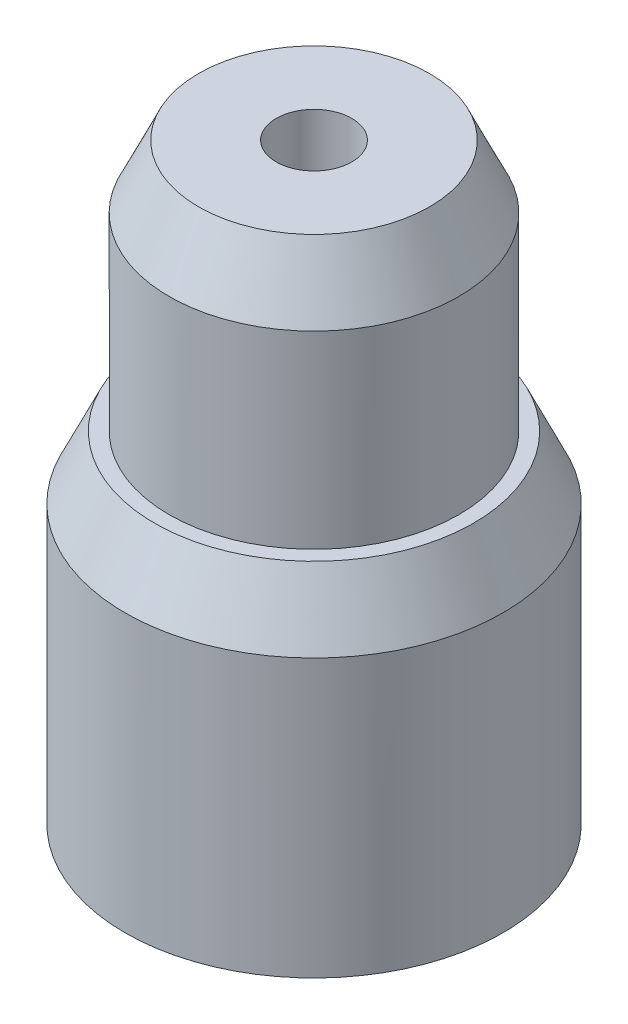
ISO-10303-21;
HEADER;
FILE_DESCRIPTION(('STEP AP214'),'2;1');
FILE_NAME('part.step','',(''),(''),'','','');
FILE_SCHEMA(('AUTOMOTIVE_DESIGN { 1 0 10303 214 1 1 1 1 }'));
ENDSEC;
DATA;
#1=APPLICATION_CONTEXT('core data for automotive mechanical design processes');
#2=APPLICATION_PROTOCOL_DEFINITION('international standard','automotive_design',2000,#1);
#3=PRODUCT_CONTEXT('',#1,'mechanical');
#4=PRODUCT('Part','Part','',(#3));
#5=PRODUCT_RELATED_PRODUCT_CATEGORY('part','',(#4));
#6=PRODUCT_DEFINITION_FORMATION('','',#4);
#7=PRODUCT_DEFINITION_CONTEXT('part definition',#1,'design');
#8=PRODUCT_DEFINITION('design','',#6,#7);
#9=PRODUCT_DEFINITION_SHAPE('','',#8);
#10=(LENGTH_UNIT() NAMED_UNIT(*) SI_UNIT(.MILLI.,.METRE.));
#11=(NAMED_UNIT(*) PLANE_ANGLE_UNIT() SI_UNIT($,.RADIAN.));
#12=(NAMED_UNIT(*) SI_UNIT($,.STERADIAN.) SOLID_ANGLE_UNIT());
#13=UNCERTAINTY_MEASURE_WITH_UNIT(LENGTH_MEASURE(1.E-05),#10,'distance_accuracy_value','');
#14=(GEOMETRIC_REPRESENTATION_CONTEXT(3) GLOBAL_UNCERTAINTY_ASSIGNED_CONTEXT((#13)) GLOBAL_UNIT_ASSIGNED_CONTEXT((#10,
#11,#12)) REPRESENTATION_CONTEXT('',''));
#15=CARTESIAN_POINT('',(0.,0.,0.));
#16=DIRECTION('',(0.,0.,1.));
#17=DIRECTION('',(1.,0.,0.));
#18=AXIS2_PLACEMENT_3D('',#15,#16,#17);
#19=CARTESIAN_POINT('',(0.,27.,0.));
#20=DIRECTION('',(0.,-1.,0.));
#21=DIRECTION('',(0.,0.,-1.));
#22=AXIS2_PLACEMENT_3D('',#19,#20,#21);
#23=CYLINDRICAL_SURFACE('',#22,15.);
#24=CARTESIAN_POINT('',(0.,21.9999999999999,0.));
#25=DIRECTION('',(0.,1.,0.));
#26=DIRECTION('',(0.,0.,1.));
#27=AXIS2_PLACEMENT_3D('',#24,#25,#26);
#28=CIRCLE('',#27,15.);
#29=CARTESIAN_POINT('',(0.,21.9999999999999,-15.));
#30=VERTEX_POINT('',#29);
#31=EDGE_CURVE('E10',#30,#30,#28,.F.);
#32=ORIENTED_EDGE('',*,*,#31,.T.);
#33=EDGE_LOOP('',(#32));
#34=FACE_BOUND('',#33,.T.);
#35=CARTESIAN_POINT('',(0.,0.,0.));
#36=DIRECTION('',(0.,1.,0.));
#37=DIRECTION('',(0.,0.,1.));
#38=AXIS2_PLACEMENT_3D('',#35,#36,#37);
#39=CIRCLE('',#38,15.);
#40=CARTESIAN_POINT('',(0.,0.,15.));
#41=VERTEX_POINT('',#40);
#42=EDGE_CURVE('E54',#41,#41,#39,.T.);
#43=ORIENTED_EDGE('',*,*,#42,.T.);
#44=EDGE_LOOP('',(#43));
#45=FACE_BOUND('',#44,.T.);
#46=ADVANCED_FACE('F34',(#34,#45),#23,.T.);
#47=CARTESIAN_POINT('',(0.,27.,0.));
#48=DIRECTION('',(0.,1.,0.));
#49=DIRECTION('',(0.,0.,1.));
#50=AXIS2_PLACEMENT_3D('',#47,#48,#49);
#51=PLANE('',#50);
#52=CARTESIAN_POINT('',(0.,27.,0.));
#53=DIRECTION('',(0.,1.,0.));
#54=DIRECTION('',(0.,0.,1.));
#55=AXIS2_PLACEMENT_3D('',#52,#53,#54);
#56=CIRCLE('',#55,12.668461709225);
#57=CARTESIAN_POINT('',(0.,27.,-12.668461709225));
#58=VERTEX_POINT('',#57);
#59=EDGE_CURVE('E41',#58,#58,#56,.T.);
#60=ORIENTED_EDGE('',*,*,#59,.T.);
#61=EDGE_LOOP('',(#60));
#62=FACE_BOUND('',#61,.T.);
#63=CARTESIAN_POINT('',(0.,27.,0.));
#64=DIRECTION('',(0.,1.,0.));
#65=DIRECTION('',(0.,0.,1.));
#66=AXIS2_PLACEMENT_3D('',#63,#64,#65);
#67=CIRCLE('',#66,11.5);
#68=CARTESIAN_POINT('',(0.,27.,11.5));
#69=VERTEX_POINT('',#68);
#70=EDGE_CURVE('E57',#69,#69,#67,.T.);
#71=ORIENTED_EDGE('',*,*,#70,.F.);
#72=EDGE_LOOP('',(#71));
#73=FACE_BOUND('',#72,.T.);
#74=ADVANCED_FACE('F100',(#62,#73),#51,.T.);
#75=CARTESIAN_POINT('',(0.,0.,0.));
#76=DIRECTION('',(0.,1.,0.));
#77=DIRECTION('',(0.,0.,1.));
#78=AXIS2_PLACEMENT_3D('',#75,#76,#77);
#79=PLANE('',#78);
#80=CARTESIAN_POINT('',(0.,0.,0.));
#81=DIRECTION('',(0.,-1.,0.));
#82=DIRECTION('',(0.,0.,-1.));
#83=AXIS2_PLACEMENT_3D('',#80,#81,#82);
#84=CIRCLE('',#83,5.);
#85=CARTESIAN_POINT('',(0.,0.,-5.));
#86=VERTEX_POINT('',#85);
#87=EDGE_CURVE('E61',#86,#86,#84,.T.);
#88=ORIENTED_EDGE('',*,*,#87,.F.);
#89=EDGE_LOOP('',(#88));
#90=FACE_BOUND('',#89,.T.);
#91=ORIENTED_EDGE('',*,*,#42,.F.);
#92=EDGE_LOOP('',(#91));
#93=FACE_BOUND('',#92,.T.);
#94=ADVANCED_FACE('F104',(#90,#93),#79,.F.);
#95=CARTESIAN_POINT('',(0.,47.,0.));
#96=DIRECTION('',(0.,-1.,0.));
#97=DIRECTION('',(0.,0.,-1.));
#98=AXIS2_PLACEMENT_3D('',#95,#96,#97);
#99=CYLINDRICAL_SURFACE('',#98,11.5);
#100=CARTESIAN_POINT('',(0.,42.,0.));
#101=DIRECTION('',(0.,1.,0.));
#102=DIRECTION('',(0.,0.,1.));
#103=AXIS2_PLACEMENT_3D('',#100,#101,#102);
#104=CIRCLE('',#103,11.5);
#105=CARTESIAN_POINT('',(0.,42.,-11.5));
#106=VERTEX_POINT('',#105);
#107=EDGE_CURVE('E45',#106,#106,#104,.F.);
#108=ORIENTED_EDGE('',*,*,#107,.T.);
#109=EDGE_LOOP('',(#108));
#110=FACE_BOUND('',#109,.T.);
#111=ORIENTED_EDGE('',*,*,#70,.T.);
#112=EDGE_LOOP('',(#111));
#113=FACE_BOUND('',#112,.T.);
#114=ADVANCED_FACE('F86',(#110,#113),#99,.T.);
#115=CARTESIAN_POINT('',(0.,47.,0.));
#116=DIRECTION('',(0.,1.,0.));
#117=DIRECTION('',(0.,0.,1.));
#118=AXIS2_PLACEMENT_3D('',#115,#116,#117);
#119=PLANE('',#118);
#120=CARTESIAN_POINT('',(0.,47.,0.));
#121=DIRECTION('',(0.,1.,0.));
#122=DIRECTION('',(0.,0.,1.));
#123=AXIS2_PLACEMENT_3D('',#120,#121,#122);
#124=CIRCLE('',#123,3.);
#125=CARTESIAN_POINT('',(0.,47.,3.));
#126=VERTEX_POINT('',#125);
#127=EDGE_CURVE('E67',#126,#126,#124,.T.);
#128=ORIENTED_EDGE('',*,*,#127,.F.);
#129=EDGE_LOOP('',(#128));
#130=FACE_BOUND('',#129,.T.);
#131=CARTESIAN_POINT('',(0.,47.,0.));
#132=DIRECTION('',(0.,1.,0.));
#133=DIRECTION('',(0.,0.,1.));
#134=AXIS2_PLACEMENT_3D('',#131,#132,#133);
#135=CIRCLE('',#134,9.16846170922502);
#136=CARTESIAN_POINT('',(0.,47.,-9.16846170922502));
#137=VERTEX_POINT('',#136);
#138=EDGE_CURVE('E49',#137,#137,#135,.T.);
#139=ORIENTED_EDGE('',*,*,#138,.T.);
#140=EDGE_LOOP('',(#139));
#141=FACE_BOUND('',#140,.T.);
#142=ADVANCED_FACE('F82',(#130,#141),#119,.T.);
#143=CARTESIAN_POINT('',(0.,47.,0.));
#144=DIRECTION('',(0.,-1.,0.));
#145=DIRECTION('',(0.,0.,-1.));
#146=AXIS2_PLACEMENT_3D('',#143,#144,#145);
#147=CONICAL_SURFACE('',#146,9.16846170922502,0.436332312998579);
#148=CARTESIAN_POINT('',(0.,42.,-11.5));
#149=CARTESIAN_POINT('',(0.,42.0520833333333,-11.4757131428044));
#150=CARTESIAN_POINT('',(0.,42.1041666666666,-11.4514262856089));
#151=CARTESIAN_POINT('',(0.,42.2083333333333,-11.4028525712177));
#152=CARTESIAN_POINT('',(0.,42.2604166666666,-11.3785657140221));
#153=CARTESIAN_POINT('',(0.,42.3645833333333,-11.329991999631));
#154=CARTESIAN_POINT('',(0.,42.4166666666666,-11.3057051424354));
#155=CARTESIAN_POINT('',(0.,42.5208333333333,-11.2571314280443));
#156=CARTESIAN_POINT('',(0.,42.5729166666666,-11.2328445708487));
#157=CARTESIAN_POINT('',(0.,42.6770833333333,-11.1842708564576));
#158=CARTESIAN_POINT('',(0.,42.7291666666666,-11.159983999262));
#159=CARTESIAN_POINT('',(0.,42.8333333333333,-11.1114102848708));
#160=CARTESIAN_POINT('',(0.,42.8854166666666,-11.0871234276753));
#161=CARTESIAN_POINT('',(0.,42.9895833333333,-11.0385497132841));
#162=CARTESIAN_POINT('',(0.,43.0416666666666,-11.0142628560885));
#163=CARTESIAN_POINT('',(0.,43.1458333333333,-10.9656891416974));
#164=CARTESIAN_POINT('',(0.,43.1979166666666,-10.9414022845018));
#165=CARTESIAN_POINT('',(0.,43.3020833333333,-10.8928285701107));
#166=CARTESIAN_POINT('',(0.,43.3541666666666,-10.8685417129151));
#167=CARTESIAN_POINT('',(0.,43.4583333333333,-10.819967998524));
#168=CARTESIAN_POINT('',(0.,43.5104166666666,-10.7956811413284));
#169=CARTESIAN_POINT('',(0.,43.6145833333333,-10.7471074269372));
#170=CARTESIAN_POINT('',(0.,43.6666666666666,-10.7228205697417));
#171=CARTESIAN_POINT('',(0.,43.7708333333333,-10.6742468553505));
#172=CARTESIAN_POINT('',(0.,43.8229166666667,-10.649959998155));
#173=CARTESIAN_POINT('',(0.,43.9270833333333,-10.6013862837638));
#174=CARTESIAN_POINT('',(0.,43.9791666666666,-10.5770994265682));
#175=CARTESIAN_POINT('',(0.,44.0833333333333,-10.5285257121771));
#176=CARTESIAN_POINT('',(0.,44.1354166666667,-10.5042388549815));
#177=CARTESIAN_POINT('',(0.,44.2395833333333,-10.4556651405904));
#178=CARTESIAN_POINT('',(0.,44.2916666666666,-10.4313782833948));
#179=CARTESIAN_POINT('',(0.,44.3958333333333,-10.3828045690037));
#180=CARTESIAN_POINT('',(0.,44.4479166666667,-10.3585177118081));
#181=CARTESIAN_POINT('',(0.,44.5520833333333,-10.3099439974169));
#182=CARTESIAN_POINT('',(0.,44.6041666666667,-10.2856571402214));
#183=CARTESIAN_POINT('',(0.,44.7083333333333,-10.2370834258302));
#184=CARTESIAN_POINT('',(0.,44.7604166666667,-10.2127965686346));
#185=CARTESIAN_POINT('',(0.,44.8645833333333,-10.1642228542435));
#186=CARTESIAN_POINT('',(0.,44.9166666666667,-10.1399359970479));
#187=CARTESIAN_POINT('',(0.,45.0208333333333,-10.0913622826568));
#188=CARTESIAN_POINT('',(0.,45.0729166666667,-10.0670754254612));
#189=CARTESIAN_POINT('',(0.,45.1770833333333,-10.0185017110701));
#190=CARTESIAN_POINT('',(0.,45.2291666666667,-9.99421485387449));
#191=CARTESIAN_POINT('',(0.,45.3333333333333,-9.94564113948335));
#192=CARTESIAN_POINT('',(0.,45.3854166666667,-9.92135428228777));
#193=CARTESIAN_POINT('',(0.,45.4895833333333,-9.87278056789663));
#194=CARTESIAN_POINT('',(0.,45.5416666666667,-9.84849371070105));
#195=CARTESIAN_POINT('',(0.,45.6458333333333,-9.79991999630991));
#196=CARTESIAN_POINT('',(0.,45.6979166666667,-9.77563313911434));
#197=CARTESIAN_POINT('',(0.,45.8020833333333,-9.72705942472319));
#198=CARTESIAN_POINT('',(0.,45.8541666666667,-9.70277256752762));
#199=CARTESIAN_POINT('',(0.,45.9583333333333,-9.65419885313647));
#200=CARTESIAN_POINT('',(0.,46.0104166666667,-9.6299119959409));
#201=CARTESIAN_POINT('',(0.,46.1145833333333,-9.58133828154975));
#202=CARTESIAN_POINT('',(0.,46.1666666666667,-9.55705142435418));
#203=CARTESIAN_POINT('',(0.,46.2708333333333,-9.50847770996303));
#204=CARTESIAN_POINT('',(0.,46.3229166666667,-9.48419085276746));
#205=CARTESIAN_POINT('',(0.,46.4270833333333,-9.43561713837632));
#206=CARTESIAN_POINT('',(0.,46.4791666666667,-9.41133028118074));
#207=CARTESIAN_POINT('',(0.,46.5833333333333,-9.3627565667896));
#208=CARTESIAN_POINT('',(0.,46.6354166666667,-9.33846970959403));
#209=CARTESIAN_POINT('',(0.,46.7395833333333,-9.28989599520288));
#210=CARTESIAN_POINT('',(0.,46.7916666666667,-9.26560913800731));
#211=CARTESIAN_POINT('',(0.,46.8958333333333,-9.21703542361616));
#212=CARTESIAN_POINT('',(0.,46.9479166666667,-9.19274856642059));
#213=CARTESIAN_POINT('',(0.,47.,-9.16846170922502));
#214=B_SPLINE_CURVE_WITH_KNOTS('',3,(#148,#149,#150,#151,#152,#153,#154,#155,#156,#157,#158,
#159,#160,#161,#162,#163,#164,#165,#166,#167,#168,#169,#170,#171,#172,#173,#174,#175,#176,#177,
#178,#179,#180,#181,#182,#183,#184,#185,#186,#187,#188,#189,#190,#191,#192,#193,#194,#195,#196,
#197,#198,#199,#200,#201,#202,#203,#204,#205,#206,#207,#208,#209,#210,#211,#212,#213),
.UNSPECIFIED.,.F.,.F.,(4,2,2,2,2,2,2,2,2,2,2,2,2,2,2,2,2,2,2,2,2,2,2,2,2,2,2,2,2,2,2,2,4),(0.,
0.172402799837886,0.344805599675779,0.517208399513665,0.689611199351557,0.86201399918945,
1.03441679902734,1.20681959886523,1.37922239870312,1.55162519854101,1.72402799837889,
1.89643079821679,2.06883359805468,2.24123639789256,2.41363919773046,2.58604199756834,
2.75844479740624,2.93084759724413,3.10325039708201,3.27565319691991,3.44805599675779,
3.62045879659569,3.79286159643358,3.96526439627146,4.13766719610936,4.31006999594724,
4.48247279578514,4.65487559562303,4.82727839546092,4.99968119529881,5.17208399513669,
5.34448679497459,5.51688959481248),.UNSPECIFIED.);
#215=EDGE_CURVE('BSEAM85',#106,#137,#214,.T.);
#216=ORIENTED_EDGE('',*,*,#107,.F.);
#217=ORIENTED_EDGE('',*,*,#138,.F.);
#218=ORIENTED_EDGE('',*,*,#215,.T.);
#219=ORIENTED_EDGE('',*,*,#215,.F.);
#220=EDGE_LOOP('',(#216,#218,#217,#219));
#221=FACE_BOUND('',#220,.T.);
#222=ADVANCED_FACE('F85',(#221),#147,.T.);
#223=CARTESIAN_POINT('',(0.,27.,0.));
#224=DIRECTION('',(0.,-1.,0.));
#225=DIRECTION('',(0.,0.,-1.));
#226=AXIS2_PLACEMENT_3D('',#223,#224,#225);
#227=CONICAL_SURFACE('',#226,12.668461709225,0.436332312998581);
#228=CARTESIAN_POINT('',(0.,21.9999999999999,-15.));
#229=CARTESIAN_POINT('',(0.,22.0520833333333,-14.9757131428044));
#230=CARTESIAN_POINT('',(0.,22.1041666666666,-14.9514262856089));
#231=CARTESIAN_POINT('',(0.,22.2083333333333,-14.9028525712177));
#232=CARTESIAN_POINT('',(0.,22.2604166666666,-14.8785657140221));
#233=CARTESIAN_POINT('',(0.,22.3645833333333,-14.829991999631));
#234=CARTESIAN_POINT('',(0.,22.4166666666666,-14.8057051424354));
#235=CARTESIAN_POINT('',(0.,22.5208333333333,-14.7571314280443));
#236=CARTESIAN_POINT('',(0.,22.5729166666666,-14.7328445708487));
#237=CARTESIAN_POINT('',(0.,22.6770833333333,-14.6842708564575));
#238=CARTESIAN_POINT('',(0.,22.7291666666666,-14.659983999262));
#239=CARTESIAN_POINT('',(0.,22.8333333333333,-14.6114102848708));
#240=CARTESIAN_POINT('',(0.,22.8854166666666,-14.5871234276753));
#241=CARTESIAN_POINT('',(0.,22.9895833333333,-14.5385497132841));
#242=CARTESIAN_POINT('',(0.,23.0416666666666,-14.5142628560885));
#243=CARTESIAN_POINT('',(0.,23.1458333333333,-14.4656891416974));
#244=CARTESIAN_POINT('',(0.,23.1979166666666,-14.4414022845018));
#245=CARTESIAN_POINT('',(0.,23.3020833333333,-14.3928285701107));
#246=CARTESIAN_POINT('',(0.,23.3541666666666,-14.3685417129151));
#247=CARTESIAN_POINT('',(0.,23.4583333333333,-14.319967998524));
#248=CARTESIAN_POINT('',(0.,23.5104166666666,-14.2956811413284));
#249=CARTESIAN_POINT('',(0.,23.6145833333333,-14.2471074269372));
#250=CARTESIAN_POINT('',(0.,23.6666666666666,-14.2228205697417));
#251=CARTESIAN_POINT('',(0.,23.7708333333333,-14.1742468553505));
#252=CARTESIAN_POINT('',(0.,23.8229166666666,-14.1499599981549));
#253=CARTESIAN_POINT('',(0.,23.9270833333333,-14.1013862837638));
#254=CARTESIAN_POINT('',(0.,23.9791666666666,-14.0770994265682));
#255=CARTESIAN_POINT('',(0.,24.0833333333333,-14.0285257121771));
#256=CARTESIAN_POINT('',(0.,24.1354166666666,-14.0042388549815));
#257=CARTESIAN_POINT('',(0.,24.2395833333333,-13.9556651405904));
#258=CARTESIAN_POINT('',(0.,24.2916666666666,-13.9313782833948));
#259=CARTESIAN_POINT('',(0.,24.3958333333333,-13.8828045690036));
#260=CARTESIAN_POINT('',(0.,24.4479166666666,-13.8585177118081));
#261=CARTESIAN_POINT('',(0.,24.5520833333333,-13.8099439974169));
#262=CARTESIAN_POINT('',(0.,24.6041666666666,-13.7856571402213));
#263=CARTESIAN_POINT('',(0.,24.7083333333333,-13.7370834258302));
#264=CARTESIAN_POINT('',(0.,24.7604166666666,-13.7127965686346));
#265=CARTESIAN_POINT('',(0.,24.8645833333333,-13.6642228542435));
#266=CARTESIAN_POINT('',(0.,24.9166666666666,-13.6399359970479));
#267=CARTESIAN_POINT('',(0.,25.0208333333333,-13.5913622826568));
#268=CARTESIAN_POINT('',(0.,25.0729166666666,-13.5670754254612));
#269=CARTESIAN_POINT('',(0.,25.1770833333333,-13.51850171107));
#270=CARTESIAN_POINT('',(0.,25.2291666666666,-13.4942148538745));
#271=CARTESIAN_POINT('',(0.,25.3333333333333,-13.4456411394833));
#272=CARTESIAN_POINT('',(0.,25.3854166666666,-13.4213542822878));
#273=CARTESIAN_POINT('',(0.,25.4895833333333,-13.3727805678966));
#274=CARTESIAN_POINT('',(0.,25.5416666666667,-13.348493710701));
#275=CARTESIAN_POINT('',(0.,25.6458333333333,-13.2999199963099));
#276=CARTESIAN_POINT('',(0.,25.6979166666667,-13.2756331391143));
#277=CARTESIAN_POINT('',(0.,25.8020833333333,-13.2270594247232));
#278=CARTESIAN_POINT('',(0.,25.8541666666667,-13.2027725675276));
#279=CARTESIAN_POINT('',(0.,25.9583333333333,-13.1541988531365));
#280=CARTESIAN_POINT('',(0.,26.0104166666667,-13.1299119959409));
#281=CARTESIAN_POINT('',(0.,26.1145833333333,-13.0813382815497));
#282=CARTESIAN_POINT('',(0.,26.1666666666667,-13.0570514243542));
#283=CARTESIAN_POINT('',(0.,26.2708333333333,-13.008477709963));
#284=CARTESIAN_POINT('',(0.,26.3229166666667,-12.9841908527674));
#285=CARTESIAN_POINT('',(0.,26.4270833333333,-12.9356171383763));
#286=CARTESIAN_POINT('',(0.,26.4791666666667,-12.9113302811807));
#287=CARTESIAN_POINT('',(0.,26.5833333333333,-12.8627565667896));
#288=CARTESIAN_POINT('',(0.,26.6354166666667,-12.838469709594));
#289=CARTESIAN_POINT('',(0.,26.7395833333333,-12.7898959952029));
#290=CARTESIAN_POINT('',(0.,26.7916666666667,-12.7656091380073));
#291=CARTESIAN_POINT('',(0.,26.8958333333333,-12.7170354236161));
#292=CARTESIAN_POINT('',(0.,26.9479166666667,-12.6927485664206));
#293=CARTESIAN_POINT('',(0.,27.,-12.668461709225));
#294=B_SPLINE_CURVE_WITH_KNOTS('',3,(#228,#229,#230,#231,#232,#233,#234,#235,#236,#237,#238,
#239,#240,#241,#242,#243,#244,#245,#246,#247,#248,#249,#250,#251,#252,#253,#254,#255,#256,#257,
#258,#259,#260,#261,#262,#263,#264,#265,#266,#267,#268,#269,#270,#271,#272,#273,#274,#275,#276,
#277,#278,#279,#280,#281,#282,#283,#284,#285,#286,#287,#288,#289,#290,#291,#292,#293),
.UNSPECIFIED.,.F.,.F.,(4,2,2,2,2,2,2,2,2,2,2,2,2,2,2,2,2,2,2,2,2,2,2,2,2,2,2,2,2,2,2,2,4),(0.,
0.172402799837889,0.344805599675783,0.517208399513672,0.689611199351562,0.862013999189454,
1.03441679902734,1.20681959886524,1.37922239870313,1.55162519854102,1.72402799837891,
1.8964307982168,2.06883359805469,2.24123639789258,2.41363919773047,2.58604199756836,
2.75844479740626,2.93084759724415,3.10325039708204,3.27565319691993,3.44805599675782,
3.62045879659571,3.7928615964336,3.96526439627149,4.13766719610938,4.31006999594728,
4.48247279578517,4.65487559562306,4.82727839546095,4.99968119529884,5.17208399513673,
5.34448679497462,5.51688959481251),.UNSPECIFIED.);
#295=EDGE_CURVE('BSEAM36',#30,#58,#294,.T.);
#296=ORIENTED_EDGE('',*,*,#31,.F.);
#297=ORIENTED_EDGE('',*,*,#59,.F.);
#298=ORIENTED_EDGE('',*,*,#295,.T.);
#299=ORIENTED_EDGE('',*,*,#295,.F.);
#300=EDGE_LOOP('',(#296,#298,#297,#299));
#301=FACE_BOUND('',#300,.T.);
#302=ADVANCED_FACE('F36',(#301),#227,.T.);
#303=CARTESIAN_POINT('',(0.,10.,0.));
#304=DIRECTION('',(0.,-1.,0.));
#305=DIRECTION('',(0.,0.,-1.));
#306=AXIS2_PLACEMENT_3D('',#303,#304,#305);
#307=CYLINDRICAL_SURFACE('',#306,5.);
#308=CARTESIAN_POINT('',(0.,10.,0.));
#309=DIRECTION('',(0.,-1.,0.));
#310=DIRECTION('',(0.,0.,-1.));
#311=AXIS2_PLACEMENT_3D('',#308,#309,#310);
#312=CIRCLE('',#311,5.);
#313=CARTESIAN_POINT('',(0.,10.,-5.));
#314=VERTEX_POINT('',#313);
#315=EDGE_CURVE('E60',#314,#314,#312,.T.);
#316=ORIENTED_EDGE('',*,*,#315,.F.);
#317=EDGE_LOOP('',(#316));
#318=FACE_BOUND('',#317,.T.);
#319=ORIENTED_EDGE('',*,*,#87,.T.);
#320=EDGE_LOOP('',(#319));
#321=FACE_BOUND('',#320,.T.);
#322=ADVANCED_FACE('F95',(#318,#321),#307,.F.);
#323=CARTESIAN_POINT('',(0.,10.,0.));
#324=DIRECTION('',(0.,-1.,0.));
#325=DIRECTION('',(0.,0.,-1.));
#326=AXIS2_PLACEMENT_3D('',#323,#324,#325);
#327=PLANE('',#326);
#328=ORIENTED_EDGE('',*,*,#315,.T.);
#329=EDGE_LOOP('',(#328));
#330=FACE_BOUND('',#329,.T.);
#331=ADVANCED_FACE('F78',(#330),#327,.T.);
#332=CARTESIAN_POINT('',(0.,37.,0.));
#333=DIRECTION('',(0.,1.,0.));
#334=DIRECTION('',(0.,0.,1.));
#335=AXIS2_PLACEMENT_3D('',#332,#333,#334);
#336=CYLINDRICAL_SURFACE('',#335,3.);
#337=CARTESIAN_POINT('',(0.,37.,0.));
#338=DIRECTION('',(0.,1.,0.));
#339=DIRECTION('',(0.,0.,1.));
#340=AXIS2_PLACEMENT_3D('',#337,#338,#339);
#341=CIRCLE('',#340,3.);
#342=CARTESIAN_POINT('',(0.,37.,3.));
#343=VERTEX_POINT('',#342);
#344=EDGE_CURVE('E64',#343,#343,#341,.T.);
#345=ORIENTED_EDGE('',*,*,#344,.F.);
#346=EDGE_LOOP('',(#345));
#347=FACE_BOUND('',#346,.T.);
#348=ORIENTED_EDGE('',*,*,#127,.T.);
#349=EDGE_LOOP('',(#348));
#350=FACE_BOUND('',#349,.T.);
#351=ADVANCED_FACE('F75',(#347,#350),#336,.F.);
#352=CARTESIAN_POINT('',(0.,37.,0.));
#353=DIRECTION('',(0.,1.,0.));
#354=DIRECTION('',(0.,0.,1.));
#355=AXIS2_PLACEMENT_3D('',#352,#353,#354);
#356=PLANE('',#355);
#357=ORIENTED_EDGE('',*,*,#344,.T.);
#358=EDGE_LOOP('',(#357));
#359=FACE_BOUND('',#358,.T.);
#360=ADVANCED_FACE('F73',(#359),#356,.T.);
#361=CLOSED_SHELL('',(#46,#74,#94,#114,#142,#222,#302,#322,#331,#351,#360));
#362=MANIFOLD_SOLID_BREP('B2',#361);
#363=ADVANCED_BREP_SHAPE_REPRESENTATION('',(#18,#362),#14);
#364=SHAPE_DEFINITION_REPRESENTATION(#9,#363);
ENDSEC;
END-ISO-10303-21;
